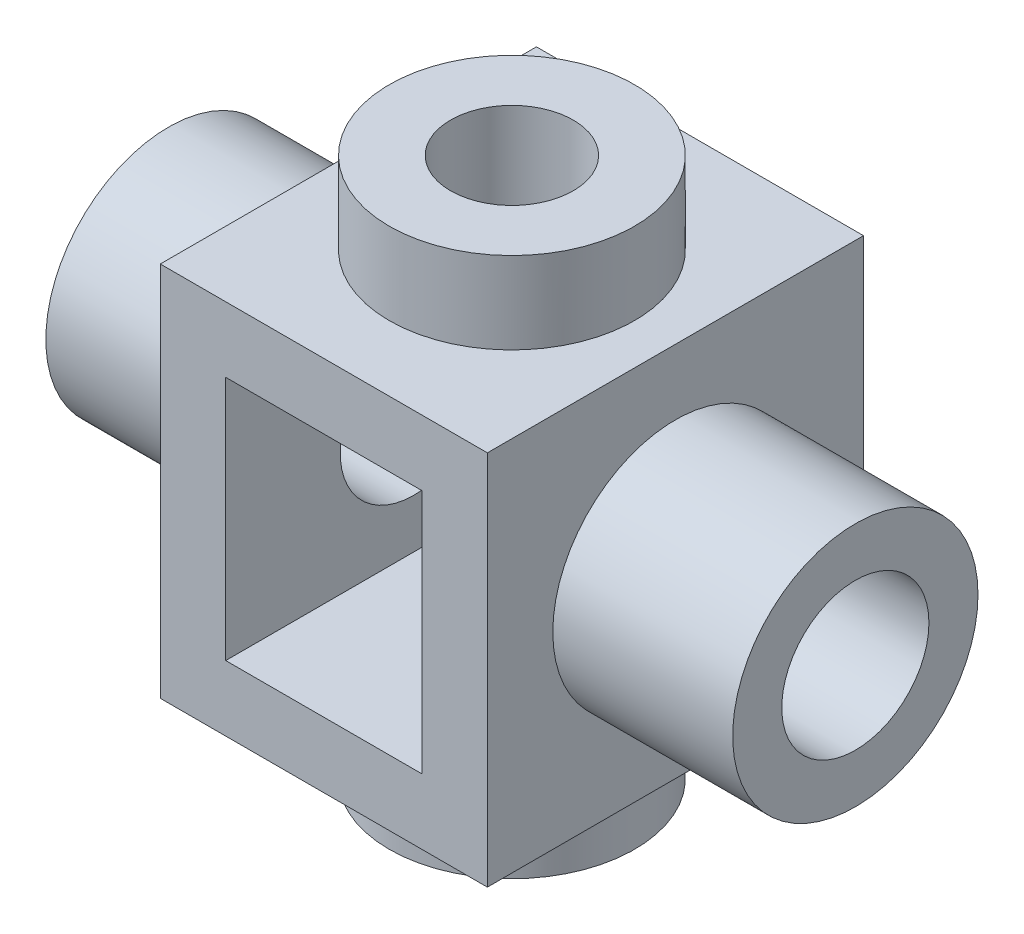
ISO-10303-21;
HEADER;
FILE_DESCRIPTION(('STEP AP214'),'2;1');
FILE_NAME('part.step','',(''),(''),'','','');
FILE_SCHEMA(('AUTOMOTIVE_DESIGN { 1 0 10303 214 1 1 1 1 }'));
ENDSEC;
DATA;
#1=APPLICATION_CONTEXT('core data for automotive mechanical design processes');
#2=APPLICATION_PROTOCOL_DEFINITION('international standard','automotive_design',2000,#1);
#3=PRODUCT_CONTEXT('',#1,'mechanical');
#4=PRODUCT('Part','Part','',(#3));
#5=PRODUCT_RELATED_PRODUCT_CATEGORY('part','',(#4));
#6=PRODUCT_DEFINITION_FORMATION('','',#4);
#7=PRODUCT_DEFINITION_CONTEXT('part definition',#1,'design');
#8=PRODUCT_DEFINITION('design','',#6,#7);
#9=PRODUCT_DEFINITION_SHAPE('','',#8);
#10=(LENGTH_UNIT() NAMED_UNIT(*) SI_UNIT(.MILLI.,.METRE.));
#11=(NAMED_UNIT(*) PLANE_ANGLE_UNIT() SI_UNIT($,.RADIAN.));
#12=(NAMED_UNIT(*) SI_UNIT($,.STERADIAN.) SOLID_ANGLE_UNIT());
#13=UNCERTAINTY_MEASURE_WITH_UNIT(LENGTH_MEASURE(1.E-05),#10,'distance_accuracy_value','');
#14=(GEOMETRIC_REPRESENTATION_CONTEXT(3) GLOBAL_UNCERTAINTY_ASSIGNED_CONTEXT((#13)) GLOBAL_UNIT_ASSIGNED_CONTEXT((#10,
#11,#12)) REPRESENTATION_CONTEXT('',''));
#15=CARTESIAN_POINT('',(0.,0.,0.));
#16=DIRECTION('',(0.,0.,1.));
#17=DIRECTION('',(1.,0.,0.));
#18=AXIS2_PLACEMENT_3D('',#15,#16,#17);
#19=CARTESIAN_POINT('',(-22.,23.,23.));
#20=DIRECTION('',(1.,0.,0.));
#21=DIRECTION('',(0.,0.,-1.));
#22=AXIS2_PLACEMENT_3D('',#19,#20,#21);
#23=CYLINDRICAL_SURFACE('',#22,9.);
#24=CARTESIAN_POINT('',(32.,23.,23.));
#25=DIRECTION('',(1.,0.,0.));
#26=DIRECTION('',(0.,0.,-1.));
#27=AXIS2_PLACEMENT_3D('',#24,#25,#26);
#28=CIRCLE('',#27,9.);
#29=CARTESIAN_POINT('',(32.,23.,14.));
#30=VERTEX_POINT('',#29);
#31=EDGE_CURVE('E135',#30,#30,#28,.F.);
#32=ORIENTED_EDGE('',*,*,#31,.T.);
#33=EDGE_LOOP('',(#32));
#34=FACE_BOUND('',#33,.T.);
#35=CARTESIAN_POINT('',(62.,23.,23.));
#36=DIRECTION('',(1.,0.,0.));
#37=DIRECTION('',(0.,0.,-1.));
#38=AXIS2_PLACEMENT_3D('',#35,#36,#37);
#39=CIRCLE('',#38,9.);
#40=CARTESIAN_POINT('',(62.,23.,14.));
#41=VERTEX_POINT('',#40);
#42=EDGE_CURVE('E143',#41,#41,#39,.T.);
#43=ORIENTED_EDGE('',*,*,#42,.T.);
#44=EDGE_LOOP('',(#43));
#45=FACE_BOUND('',#44,.T.);
#46=ADVANCED_FACE('F36',(#34,#45),#23,.F.);
#47=CARTESIAN_POINT('',(0.,0.,46.));
#48=DIRECTION('',(1.,0.,0.));
#49=DIRECTION('',(0.,0.,-1.));
#50=AXIS2_PLACEMENT_3D('',#47,#48,#49);
#51=PLANE('',#50);
#52=CARTESIAN_POINT('',(0.,23.,23.));
#53=DIRECTION('',(1.,0.,0.));
#54=DIRECTION('',(0.,0.,-1.));
#55=AXIS2_PLACEMENT_3D('',#52,#53,#54);
#56=CIRCLE('',#55,15.);
#57=CARTESIAN_POINT('',(0.,23.,8.));
#58=VERTEX_POINT('',#57);
#59=EDGE_CURVE('E156',#58,#58,#56,.T.);
#60=ORIENTED_EDGE('',*,*,#59,.T.);
#61=EDGE_LOOP('',(#60));
#62=FACE_BOUND('',#61,.T.);
#63=DIRECTION('',(0.,-1.,0.));
#64=VECTOR('',#63,1.);
#65=CARTESIAN_POINT('',(0.,0.,0.));
#66=LINE('',#65,#64);
#67=CARTESIAN_POINT('',(0.,46.,0.));
#68=VERTEX_POINT('',#67);
#69=CARTESIAN_POINT('',(0.,0.,0.));
#70=VERTEX_POINT('',#69);
#71=EDGE_CURVE('E175',#68,#70,#66,.T.);
#72=ORIENTED_EDGE('',*,*,#71,.T.);
#73=DIRECTION('',(0.,0.,-1.));
#74=VECTOR('',#73,1.);
#75=CARTESIAN_POINT('',(0.,0.,46.));
#76=LINE('',#75,#74);
#77=CARTESIAN_POINT('',(0.,0.,46.));
#78=VERTEX_POINT('',#77);
#79=EDGE_CURVE('E11',#78,#70,#76,.T.);
#80=ORIENTED_EDGE('',*,*,#79,.F.);
#81=DIRECTION('',(0.,-1.,0.));
#82=VECTOR('',#81,1.);
#83=CARTESIAN_POINT('',(0.,0.,46.));
#84=LINE('',#83,#82);
#85=CARTESIAN_POINT('',(0.,46.,46.));
#86=VERTEX_POINT('',#85);
#87=EDGE_CURVE('E176',#86,#78,#84,.T.);
#88=ORIENTED_EDGE('',*,*,#87,.F.);
#89=DIRECTION('',(0.,0.,-1.));
#90=VECTOR('',#89,1.);
#91=CARTESIAN_POINT('',(0.,46.,46.));
#92=LINE('',#91,#90);
#93=EDGE_CURVE('E186',#86,#68,#92,.T.);
#94=ORIENTED_EDGE('',*,*,#93,.T.);
#95=EDGE_LOOP('',(#72,#80,#88,#94));
#96=FACE_BOUND('',#95,.T.);
#97=ADVANCED_FACE('F38',(#62,#96),#51,.F.);
#98=CARTESIAN_POINT('',(0.,0.,46.));
#99=DIRECTION('',(0.,1.,0.));
#100=DIRECTION('',(0.,0.,1.));
#101=AXIS2_PLACEMENT_3D('',#98,#99,#100);
#102=PLANE('',#101);
#103=CARTESIAN_POINT('',(20.,0.,23.));
#104=DIRECTION('',(0.,1.,0.));
#105=DIRECTION('',(0.,0.,1.));
#106=AXIS2_PLACEMENT_3D('',#103,#104,#105);
#107=CIRCLE('',#106,15.);
#108=CARTESIAN_POINT('',(20.,0.,38.));
#109=VERTEX_POINT('',#108);
#110=EDGE_CURVE('E172',#109,#109,#107,.T.);
#111=ORIENTED_EDGE('',*,*,#110,.T.);
#112=EDGE_LOOP('',(#111));
#113=FACE_BOUND('',#112,.T.);
#114=DIRECTION('',(1.,0.,0.));
#115=VECTOR('',#114,1.);
#116=CARTESIAN_POINT('',(0.,0.,0.));
#117=LINE('',#116,#115);
#118=CARTESIAN_POINT('',(40.,0.,0.));
#119=VERTEX_POINT('',#118);
#120=EDGE_CURVE('E189',#70,#119,#117,.T.);
#121=ORIENTED_EDGE('',*,*,#120,.T.);
#122=DIRECTION('',(0.,0.,-1.));
#123=VECTOR('',#122,1.);
#124=CARTESIAN_POINT('',(40.,0.,46.));
#125=LINE('',#124,#123);
#126=CARTESIAN_POINT('',(40.,0.,46.));
#127=VERTEX_POINT('',#126);
#128=EDGE_CURVE('E45',#127,#119,#125,.T.);
#129=ORIENTED_EDGE('',*,*,#128,.F.);
#130=DIRECTION('',(1.,0.,0.));
#131=VECTOR('',#130,1.);
#132=CARTESIAN_POINT('',(0.,0.,46.));
#133=LINE('',#132,#131);
#134=EDGE_CURVE('E179',#78,#127,#133,.T.);
#135=ORIENTED_EDGE('',*,*,#134,.F.);
#136=ORIENTED_EDGE('',*,*,#79,.T.);
#137=EDGE_LOOP('',(#121,#129,#135,#136));
#138=FACE_BOUND('',#137,.T.);
#139=ADVANCED_FACE('F234',(#113,#138),#102,.F.);
#140=CARTESIAN_POINT('',(40.,0.,46.));
#141=DIRECTION('',(-1.,0.,0.));
#142=DIRECTION('',(0.,0.,1.));
#143=AXIS2_PLACEMENT_3D('',#140,#141,#142);
#144=PLANE('',#143);
#145=CARTESIAN_POINT('',(40.,23.,23.));
#146=DIRECTION('',(-1.,0.,0.));
#147=DIRECTION('',(0.,0.,1.));
#148=AXIS2_PLACEMENT_3D('',#145,#146,#147);
#149=CIRCLE('',#148,15.);
#150=CARTESIAN_POINT('',(40.,23.,38.));
#151=VERTEX_POINT('',#150);
#152=EDGE_CURVE('E155',#151,#151,#149,.T.);
#153=ORIENTED_EDGE('',*,*,#152,.T.);
#154=EDGE_LOOP('',(#153));
#155=FACE_BOUND('',#154,.T.);
#156=DIRECTION('',(0.,1.,0.));
#157=VECTOR('',#156,1.);
#158=CARTESIAN_POINT('',(40.,0.,0.));
#159=LINE('',#158,#157);
#160=CARTESIAN_POINT('',(40.,46.,0.));
#161=VERTEX_POINT('',#160);
#162=EDGE_CURVE('E191',#119,#161,#159,.T.);
#163=ORIENTED_EDGE('',*,*,#162,.T.);
#164=DIRECTION('',(0.,0.,-1.));
#165=VECTOR('',#164,1.);
#166=CARTESIAN_POINT('',(40.,46.,46.));
#167=LINE('',#166,#165);
#168=CARTESIAN_POINT('',(40.,46.,46.));
#169=VERTEX_POINT('',#168);
#170=EDGE_CURVE('E196',#169,#161,#167,.T.);
#171=ORIENTED_EDGE('',*,*,#170,.F.);
#172=DIRECTION('',(0.,1.,0.));
#173=VECTOR('',#172,1.);
#174=CARTESIAN_POINT('',(40.,0.,46.));
#175=LINE('',#174,#173);
#176=EDGE_CURVE('E182',#127,#169,#175,.T.);
#177=ORIENTED_EDGE('',*,*,#176,.F.);
#178=ORIENTED_EDGE('',*,*,#128,.T.);
#179=EDGE_LOOP('',(#163,#171,#177,#178));
#180=FACE_BOUND('',#179,.T.);
#181=ADVANCED_FACE('F275',(#155,#180),#144,.F.);
#182=CARTESIAN_POINT('',(0.,46.,46.));
#183=DIRECTION('',(0.,-1.,0.));
#184=DIRECTION('',(0.,0.,-1.));
#185=AXIS2_PLACEMENT_3D('',#182,#183,#184);
#186=PLANE('',#185);
#187=CARTESIAN_POINT('',(20.,46.,23.));
#188=DIRECTION('',(0.,-1.,0.));
#189=DIRECTION('',(0.,0.,-1.));
#190=AXIS2_PLACEMENT_3D('',#187,#188,#189);
#191=CIRCLE('',#190,15.);
#192=CARTESIAN_POINT('',(20.,46.,8.00000000000001));
#193=VERTEX_POINT('',#192);
#194=EDGE_CURVE('E171',#193,#193,#191,.T.);
#195=ORIENTED_EDGE('',*,*,#194,.T.);
#196=EDGE_LOOP('',(#195));
#197=FACE_BOUND('',#196,.T.);
#198=DIRECTION('',(-1.,0.,0.));
#199=VECTOR('',#198,1.);
#200=CARTESIAN_POINT('',(0.,46.,0.));
#201=LINE('',#200,#199);
#202=EDGE_CURVE('E180',#161,#68,#201,.T.);
#203=ORIENTED_EDGE('',*,*,#202,.T.);
#204=ORIENTED_EDGE('',*,*,#93,.F.);
#205=DIRECTION('',(-1.,0.,0.));
#206=VECTOR('',#205,1.);
#207=CARTESIAN_POINT('',(0.,46.,46.));
#208=LINE('',#207,#206);
#209=EDGE_CURVE('E184',#169,#86,#208,.T.);
#210=ORIENTED_EDGE('',*,*,#209,.F.);
#211=ORIENTED_EDGE('',*,*,#170,.T.);
#212=EDGE_LOOP('',(#203,#204,#210,#211));
#213=FACE_BOUND('',#212,.T.);
#214=ADVANCED_FACE('F273',(#197,#213),#186,.F.);
#215=CARTESIAN_POINT('',(0.,0.,46.));
#216=DIRECTION('',(0.,0.,-1.));
#217=DIRECTION('',(-1.,0.,0.));
#218=AXIS2_PLACEMENT_3D('',#215,#216,#217);
#219=PLANE('',#218);
#220=DIRECTION('',(-1.,0.,0.));
#221=VECTOR('',#220,1.);
#222=CARTESIAN_POINT('',(8.00000000000001,38.,46.));
#223=LINE('',#222,#221);
#224=CARTESIAN_POINT('',(32.,38.,46.));
#225=VERTEX_POINT('',#224);
#226=CARTESIAN_POINT('',(8.00000000000001,38.,46.));
#227=VERTEX_POINT('',#226);
#228=EDGE_CURVE('E116',#225,#227,#223,.T.);
#229=ORIENTED_EDGE('',*,*,#228,.F.);
#230=DIRECTION('',(0.,1.,0.));
#231=VECTOR('',#230,1.);
#232=CARTESIAN_POINT('',(32.,8.00000000000001,46.));
#233=LINE('',#232,#231);
#234=CARTESIAN_POINT('',(32.,8.00000000000001,46.));
#235=VERTEX_POINT('',#234);
#236=EDGE_CURVE('E53',#235,#225,#233,.T.);
#237=ORIENTED_EDGE('',*,*,#236,.F.);
#238=DIRECTION('',(1.,0.,0.));
#239=VECTOR('',#238,1.);
#240=CARTESIAN_POINT('',(8.00000000000002,8.00000000000001,46.));
#241=LINE('',#240,#239);
#242=CARTESIAN_POINT('',(8.00000000000002,8.00000000000001,46.));
#243=VERTEX_POINT('',#242);
#244=EDGE_CURVE('E124',#243,#235,#241,.T.);
#245=ORIENTED_EDGE('',*,*,#244,.F.);
#246=DIRECTION('',(0.,-1.,0.));
#247=VECTOR('',#246,1.);
#248=CARTESIAN_POINT('',(8.00000000000002,8.00000000000001,46.));
#249=LINE('',#248,#247);
#250=EDGE_CURVE('E107',#227,#243,#249,.T.);
#251=ORIENTED_EDGE('',*,*,#250,.F.);
#252=EDGE_LOOP('',(#229,#237,#245,#251));
#253=FACE_BOUND('',#252,.T.);
#254=ORIENTED_EDGE('',*,*,#87,.T.);
#255=ORIENTED_EDGE('',*,*,#134,.T.);
#256=ORIENTED_EDGE('',*,*,#176,.T.);
#257=ORIENTED_EDGE('',*,*,#209,.T.);
#258=EDGE_LOOP('',(#254,#255,#256,#257));
#259=FACE_BOUND('',#258,.T.);
#260=ADVANCED_FACE('F121',(#253,#259),#219,.F.);
#261=CARTESIAN_POINT('',(0.,0.,0.));
#262=DIRECTION('',(0.,0.,-1.));
#263=DIRECTION('',(-1.,0.,0.));
#264=AXIS2_PLACEMENT_3D('',#261,#262,#263);
#265=PLANE('',#264);
#266=DIRECTION('',(0.,-1.,0.));
#267=VECTOR('',#266,1.);
#268=CARTESIAN_POINT('',(32.,0.,0.));
#269=LINE('',#268,#267);
#270=CARTESIAN_POINT('',(32.,38.,0.));
#271=VERTEX_POINT('',#270);
#272=CARTESIAN_POINT('',(32.,8.00000000000001,0.));
#273=VERTEX_POINT('',#272);
#274=EDGE_CURVE('E136',#271,#273,#269,.T.);
#275=ORIENTED_EDGE('',*,*,#274,.F.);
#276=DIRECTION('',(1.,0.,0.));
#277=VECTOR('',#276,1.);
#278=CARTESIAN_POINT('',(0.,38.,0.));
#279=LINE('',#278,#277);
#280=CARTESIAN_POINT('',(8.00000000000001,38.,0.));
#281=VERTEX_POINT('',#280);
#282=EDGE_CURVE('E141',#281,#271,#279,.T.);
#283=ORIENTED_EDGE('',*,*,#282,.F.);
#284=DIRECTION('',(0.,1.,0.));
#285=VECTOR('',#284,1.);
#286=CARTESIAN_POINT('',(8.00000000000002,0.,0.));
#287=LINE('',#286,#285);
#288=CARTESIAN_POINT('',(8.00000000000002,8.00000000000001,0.));
#289=VERTEX_POINT('',#288);
#290=EDGE_CURVE('E110',#289,#281,#287,.T.);
#291=ORIENTED_EDGE('',*,*,#290,.F.);
#292=DIRECTION('',(-1.,0.,0.));
#293=VECTOR('',#292,1.);
#294=CARTESIAN_POINT('',(0.,8.00000000000001,0.));
#295=LINE('',#294,#293);
#296=EDGE_CURVE('E139',#273,#289,#295,.T.);
#297=ORIENTED_EDGE('',*,*,#296,.F.);
#298=EDGE_LOOP('',(#275,#283,#291,#297));
#299=FACE_BOUND('',#298,.T.);
#300=ORIENTED_EDGE('',*,*,#71,.F.);
#301=ORIENTED_EDGE('',*,*,#202,.F.);
#302=ORIENTED_EDGE('',*,*,#162,.F.);
#303=ORIENTED_EDGE('',*,*,#120,.F.);
#304=EDGE_LOOP('',(#300,#301,#302,#303));
#305=FACE_BOUND('',#304,.T.);
#306=ADVANCED_FACE('F265',(#299,#305),#265,.T.);
#307=CARTESIAN_POINT('',(20.,-10.,23.));
#308=DIRECTION('',(0.,1.,0.));
#309=DIRECTION('',(0.,0.,1.));
#310=AXIS2_PLACEMENT_3D('',#307,#308,#309);
#311=CYLINDRICAL_SURFACE('',#310,15.);
#312=CARTESIAN_POINT('',(20.,56.,23.));
#313=DIRECTION('',(0.,1.,0.));
#314=DIRECTION('',(0.,0.,1.));
#315=AXIS2_PLACEMENT_3D('',#312,#313,#314);
#316=CIRCLE('',#315,15.);
#317=CARTESIAN_POINT('',(20.,56.,38.));
#318=VERTEX_POINT('',#317);
#319=EDGE_CURVE('E162',#318,#318,#316,.T.);
#320=ORIENTED_EDGE('',*,*,#319,.F.);
#321=EDGE_LOOP('',(#320));
#322=FACE_BOUND('',#321,.T.);
#323=ORIENTED_EDGE('',*,*,#194,.F.);
#324=EDGE_LOOP('',(#323));
#325=FACE_BOUND('',#324,.T.);
#326=ADVANCED_FACE('F289',(#322,#325),#311,.T.);
#327=CARTESIAN_POINT('',(20.,56.,23.));
#328=DIRECTION('',(0.,1.,0.));
#329=DIRECTION('',(0.,0.,1.));
#330=AXIS2_PLACEMENT_3D('',#327,#328,#329);
#331=PLANE('',#330);
#332=ORIENTED_EDGE('',*,*,#319,.T.);
#333=EDGE_LOOP('',(#332));
#334=FACE_BOUND('',#333,.T.);
#335=CARTESIAN_POINT('',(20.,56.,23.));
#336=DIRECTION('',(0.,1.,0.));
#337=DIRECTION('',(0.,0.,1.));
#338=AXIS2_PLACEMENT_3D('',#335,#336,#337);
#339=CIRCLE('',#338,7.5);
#340=CARTESIAN_POINT('',(20.,56.,30.5));
#341=VERTEX_POINT('',#340);
#342=EDGE_CURVE('E159',#341,#341,#339,.T.);
#343=ORIENTED_EDGE('',*,*,#342,.F.);
#344=EDGE_LOOP('',(#343));
#345=FACE_BOUND('',#344,.T.);
#346=ADVANCED_FACE('F304',(#334,#345),#331,.T.);
#347=CARTESIAN_POINT('',(20.,-10.,23.));
#348=DIRECTION('',(0.,1.,0.));
#349=DIRECTION('',(0.,0.,1.));
#350=AXIS2_PLACEMENT_3D('',#347,#348,#349);
#351=CYLINDRICAL_SURFACE('',#350,7.5);
#352=CARTESIAN_POINT('',(20.,38.,23.));
#353=DIRECTION('',(0.,1.,0.));
#354=DIRECTION('',(0.,0.,1.));
#355=AXIS2_PLACEMENT_3D('',#352,#353,#354);
#356=CIRCLE('',#355,7.5);
#357=CARTESIAN_POINT('',(20.,38.,30.5));
#358=VERTEX_POINT('',#357);
#359=EDGE_CURVE('E40',#358,#358,#356,.F.);
#360=ORIENTED_EDGE('',*,*,#359,.T.);
#361=EDGE_LOOP('',(#360));
#362=FACE_BOUND('',#361,.T.);
#363=ORIENTED_EDGE('',*,*,#342,.T.);
#364=EDGE_LOOP('',(#363));
#365=FACE_BOUND('',#364,.T.);
#366=ADVANCED_FACE('F296',(#362,#365),#351,.F.);
#367=CARTESIAN_POINT('',(20.,-10.,23.));
#368=DIRECTION('',(0.,1.,0.));
#369=DIRECTION('',(0.,0.,1.));
#370=AXIS2_PLACEMENT_3D('',#367,#368,#369);
#371=CIRCLE('',#370,15.);
#372=CARTESIAN_POINT('',(20.,-10.,38.));
#373=VERTEX_POINT('',#372);
#374=EDGE_CURVE('E168',#373,#373,#371,.T.);
#375=ORIENTED_EDGE('',*,*,#374,.T.);
#376=EDGE_LOOP('',(#375));
#377=FACE_BOUND('',#376,.T.);
#378=ORIENTED_EDGE('',*,*,#110,.F.);
#379=EDGE_LOOP('',(#378));
#380=FACE_BOUND('',#379,.T.);
#381=ADVANCED_FACE('F293',(#377,#380),#311,.T.);
#382=CARTESIAN_POINT('',(20.,8.00000000000001,23.));
#383=DIRECTION('',(0.,-1.,0.));
#384=DIRECTION('',(0.,0.,-1.));
#385=AXIS2_PLACEMENT_3D('',#382,#383,#384);
#386=CIRCLE('',#385,7.5);
#387=CARTESIAN_POINT('',(20.,8.00000000000001,15.5));
#388=VERTEX_POINT('',#387);
#389=EDGE_CURVE('E138',#388,#388,#386,.F.);
#390=ORIENTED_EDGE('',*,*,#389,.T.);
#391=EDGE_LOOP('',(#390));
#392=FACE_BOUND('',#391,.T.);
#393=CARTESIAN_POINT('',(20.,-10.,23.));
#394=DIRECTION('',(0.,1.,0.));
#395=DIRECTION('',(0.,0.,1.));
#396=AXIS2_PLACEMENT_3D('',#393,#394,#395);
#397=CIRCLE('',#396,7.5);
#398=CARTESIAN_POINT('',(20.,-10.,30.5));
#399=VERTEX_POINT('',#398);
#400=EDGE_CURVE('E165',#399,#399,#397,.T.);
#401=ORIENTED_EDGE('',*,*,#400,.F.);
#402=EDGE_LOOP('',(#401));
#403=FACE_BOUND('',#402,.T.);
#404=ADVANCED_FACE('F211',(#392,#403),#351,.F.);
#405=CARTESIAN_POINT('',(20.,-10.,23.));
#406=DIRECTION('',(0.,1.,0.));
#407=DIRECTION('',(0.,0.,1.));
#408=AXIS2_PLACEMENT_3D('',#405,#406,#407);
#409=PLANE('',#408);
#410=ORIENTED_EDGE('',*,*,#400,.T.);
#411=EDGE_LOOP('',(#410));
#412=FACE_BOUND('',#411,.T.);
#413=ORIENTED_EDGE('',*,*,#374,.F.);
#414=EDGE_LOOP('',(#413));
#415=FACE_BOUND('',#414,.T.);
#416=ADVANCED_FACE('F298',(#412,#415),#409,.F.);
#417=CARTESIAN_POINT('',(-22.,23.,23.));
#418=DIRECTION('',(1.,0.,0.));
#419=DIRECTION('',(0.,0.,-1.));
#420=AXIS2_PLACEMENT_3D('',#417,#418,#419);
#421=CYLINDRICAL_SURFACE('',#420,15.);
#422=CARTESIAN_POINT('',(62.,23.,23.));
#423=DIRECTION('',(1.,0.,0.));
#424=DIRECTION('',(0.,0.,-1.));
#425=AXIS2_PLACEMENT_3D('',#422,#423,#424);
#426=CIRCLE('',#425,15.);
#427=CARTESIAN_POINT('',(62.,23.,8.));
#428=VERTEX_POINT('',#427);
#429=EDGE_CURVE('E146',#428,#428,#426,.T.);
#430=ORIENTED_EDGE('',*,*,#429,.F.);
#431=EDGE_LOOP('',(#430));
#432=FACE_BOUND('',#431,.T.);
#433=ORIENTED_EDGE('',*,*,#152,.F.);
#434=EDGE_LOOP('',(#433));
#435=FACE_BOUND('',#434,.T.);
#436=ADVANCED_FACE('F250',(#432,#435),#421,.T.);
#437=CARTESIAN_POINT('',(62.,23.,23.));
#438=DIRECTION('',(1.,0.,0.));
#439=DIRECTION('',(0.,0.,-1.));
#440=AXIS2_PLACEMENT_3D('',#437,#438,#439);
#441=PLANE('',#440);
#442=ORIENTED_EDGE('',*,*,#429,.T.);
#443=EDGE_LOOP('',(#442));
#444=FACE_BOUND('',#443,.T.);
#445=ORIENTED_EDGE('',*,*,#42,.F.);
#446=EDGE_LOOP('',(#445));
#447=FACE_BOUND('',#446,.T.);
#448=ADVANCED_FACE('F247',(#444,#447),#441,.T.);
#449=CARTESIAN_POINT('',(-22.,23.,23.));
#450=DIRECTION('',(1.,0.,0.));
#451=DIRECTION('',(0.,0.,-1.));
#452=AXIS2_PLACEMENT_3D('',#449,#450,#451);
#453=CIRCLE('',#452,15.);
#454=CARTESIAN_POINT('',(-22.,23.,8.));
#455=VERTEX_POINT('',#454);
#456=EDGE_CURVE('E152',#455,#455,#453,.T.);
#457=ORIENTED_EDGE('',*,*,#456,.T.);
#458=EDGE_LOOP('',(#457));
#459=FACE_BOUND('',#458,.T.);
#460=ORIENTED_EDGE('',*,*,#59,.F.);
#461=EDGE_LOOP('',(#460));
#462=FACE_BOUND('',#461,.T.);
#463=ADVANCED_FACE('F240',(#459,#462),#421,.T.);
#464=CARTESIAN_POINT('',(8.00000000000001,23.,23.));
#465=DIRECTION('',(-1.,0.,0.));
#466=DIRECTION('',(0.,-1.,0.));
#467=AXIS2_PLACEMENT_3D('',#464,#465,#466);
#468=CIRCLE('',#467,9.);
#469=CARTESIAN_POINT('',(8.00000000000002,14.,23.));
#470=VERTEX_POINT('',#469);
#471=EDGE_CURVE('E131',#470,#470,#468,.F.);
#472=ORIENTED_EDGE('',*,*,#471,.T.);
#473=EDGE_LOOP('',(#472));
#474=FACE_BOUND('',#473,.T.);
#475=CARTESIAN_POINT('',(-22.,23.,23.));
#476=DIRECTION('',(1.,0.,0.));
#477=DIRECTION('',(0.,0.,-1.));
#478=AXIS2_PLACEMENT_3D('',#475,#476,#477);
#479=CIRCLE('',#478,9.);
#480=CARTESIAN_POINT('',(-22.,23.,14.));
#481=VERTEX_POINT('',#480);
#482=EDGE_CURVE('E149',#481,#481,#479,.T.);
#483=ORIENTED_EDGE('',*,*,#482,.F.);
#484=EDGE_LOOP('',(#483));
#485=FACE_BOUND('',#484,.T.);
#486=ADVANCED_FACE('F230',(#474,#485),#23,.F.);
#487=CARTESIAN_POINT('',(-22.,23.,23.));
#488=DIRECTION('',(1.,0.,0.));
#489=DIRECTION('',(0.,0.,-1.));
#490=AXIS2_PLACEMENT_3D('',#487,#488,#489);
#491=PLANE('',#490);
#492=ORIENTED_EDGE('',*,*,#482,.T.);
#493=EDGE_LOOP('',(#492));
#494=FACE_BOUND('',#493,.T.);
#495=ORIENTED_EDGE('',*,*,#456,.F.);
#496=EDGE_LOOP('',(#495));
#497=FACE_BOUND('',#496,.T.);
#498=ADVANCED_FACE('F224',(#494,#497),#491,.F.);
#499=CARTESIAN_POINT('',(8.00000000000001,38.,-84.));
#500=DIRECTION('',(0.,1.,0.));
#501=DIRECTION('',(0.,0.,1.));
#502=AXIS2_PLACEMENT_3D('',#499,#500,#501);
#503=PLANE('',#502);
#504=ORIENTED_EDGE('',*,*,#282,.T.);
#505=DIRECTION('',(0.,0.,1.));
#506=VECTOR('',#505,1.);
#507=CARTESIAN_POINT('',(32.,38.,-84.));
#508=LINE('',#507,#506);
#509=EDGE_CURVE('E113',#271,#225,#508,.T.);
#510=ORIENTED_EDGE('',*,*,#509,.T.);
#511=ORIENTED_EDGE('',*,*,#228,.T.);
#512=DIRECTION('',(0.,0.,1.));
#513=VECTOR('',#512,1.);
#514=CARTESIAN_POINT('',(8.00000000000001,38.,-84.));
#515=LINE('',#514,#513);
#516=EDGE_CURVE('E61',#281,#227,#515,.T.);
#517=ORIENTED_EDGE('',*,*,#516,.F.);
#518=EDGE_LOOP('',(#504,#510,#511,#517));
#519=FACE_BOUND('',#518,.T.);
#520=ORIENTED_EDGE('',*,*,#359,.F.);
#521=EDGE_LOOP('',(#520));
#522=FACE_BOUND('',#521,.T.);
#523=ADVANCED_FACE('F117',(#519,#522),#503,.F.);
#524=CARTESIAN_POINT('',(8.00000000000002,8.00000000000001,-84.));
#525=DIRECTION('',(0.,-1.,0.));
#526=DIRECTION('',(0.,0.,-1.));
#527=AXIS2_PLACEMENT_3D('',#524,#525,#526);
#528=PLANE('',#527);
#529=ORIENTED_EDGE('',*,*,#296,.T.);
#530=DIRECTION('',(0.,0.,1.));
#531=VECTOR('',#530,1.);
#532=CARTESIAN_POINT('',(8.00000000000002,8.00000000000001,-84.));
#533=LINE('',#532,#531);
#534=EDGE_CURVE('E112',#289,#243,#533,.T.);
#535=ORIENTED_EDGE('',*,*,#534,.T.);
#536=ORIENTED_EDGE('',*,*,#244,.T.);
#537=DIRECTION('',(0.,0.,1.));
#538=VECTOR('',#537,1.);
#539=CARTESIAN_POINT('',(32.,8.00000000000001,-84.));
#540=LINE('',#539,#538);
#541=EDGE_CURVE('E129',#273,#235,#540,.T.);
#542=ORIENTED_EDGE('',*,*,#541,.F.);
#543=EDGE_LOOP('',(#529,#535,#536,#542));
#544=FACE_BOUND('',#543,.T.);
#545=ORIENTED_EDGE('',*,*,#389,.F.);
#546=EDGE_LOOP('',(#545));
#547=FACE_BOUND('',#546,.T.);
#548=ADVANCED_FACE('F214',(#544,#547),#528,.F.);
#549=CARTESIAN_POINT('',(32.,8.00000000000001,-84.));
#550=DIRECTION('',(1.,0.,0.));
#551=DIRECTION('',(0.,0.,-1.));
#552=AXIS2_PLACEMENT_3D('',#549,#550,#551);
#553=PLANE('',#552);
#554=ORIENTED_EDGE('',*,*,#274,.T.);
#555=ORIENTED_EDGE('',*,*,#541,.T.);
#556=ORIENTED_EDGE('',*,*,#236,.T.);
#557=ORIENTED_EDGE('',*,*,#509,.F.);
#558=EDGE_LOOP('',(#554,#555,#556,#557));
#559=FACE_BOUND('',#558,.T.);
#560=ORIENTED_EDGE('',*,*,#31,.F.);
#561=EDGE_LOOP('',(#560));
#562=FACE_BOUND('',#561,.T.);
#563=ADVANCED_FACE('F216',(#559,#562),#553,.F.);
#564=CARTESIAN_POINT('',(8.00000000000002,8.00000000000001,-84.));
#565=DIRECTION('',(-1.,0.,0.));
#566=DIRECTION('',(0.,-1.,0.));
#567=AXIS2_PLACEMENT_3D('',#564,#565,#566);
#568=PLANE('',#567);
#569=ORIENTED_EDGE('',*,*,#290,.T.);
#570=ORIENTED_EDGE('',*,*,#516,.T.);
#571=ORIENTED_EDGE('',*,*,#250,.T.);
#572=ORIENTED_EDGE('',*,*,#534,.F.);
#573=EDGE_LOOP('',(#569,#570,#571,#572));
#574=FACE_BOUND('',#573,.T.);
#575=ORIENTED_EDGE('',*,*,#471,.F.);
#576=EDGE_LOOP('',(#575));
#577=FACE_BOUND('',#576,.T.);
#578=ADVANCED_FACE('F103',(#574,#577),#568,.F.);
#579=CLOSED_SHELL('',(#46,#97,#139,#181,#214,#260,#306,#326,#346,#366,#381,#404,#416,#436,#448,
#463,#486,#498,#523,#548,#563,#578));
#580=MANIFOLD_SOLID_BREP('B2',#579);
#581=ADVANCED_BREP_SHAPE_REPRESENTATION('',(#18,#580),#14);
#582=SHAPE_DEFINITION_REPRESENTATION(#9,#581);
ENDSEC;
END-ISO-10303-21;
